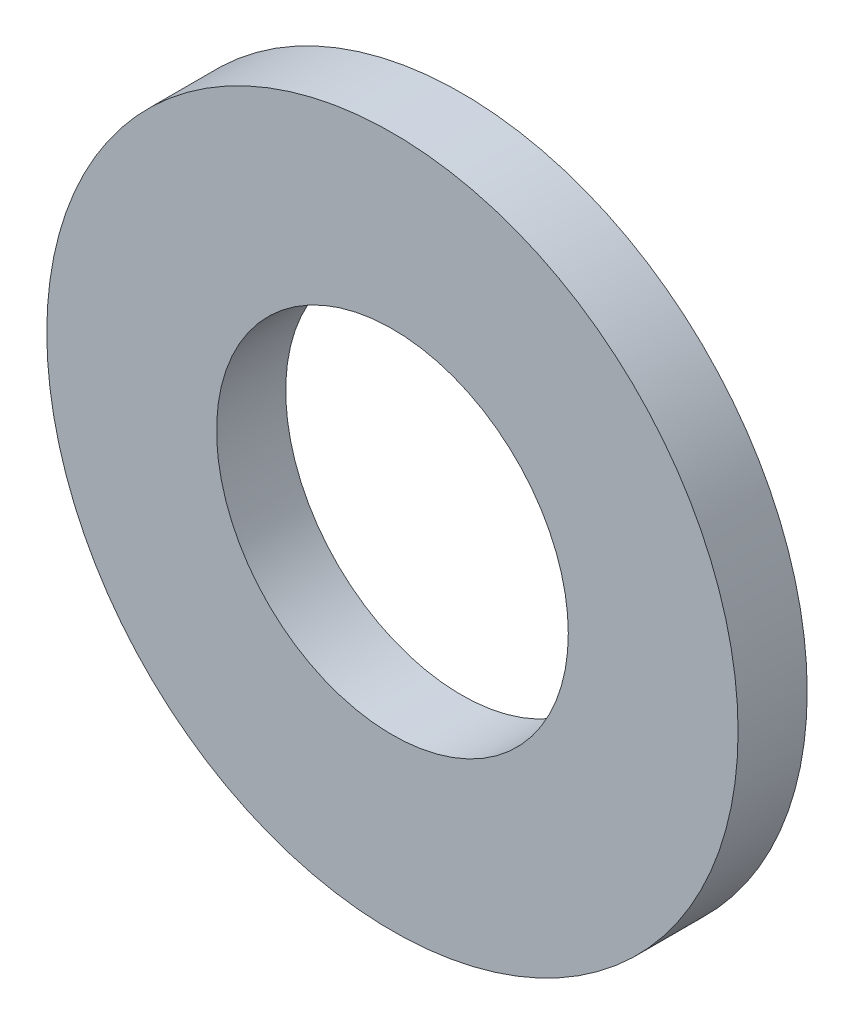
ISO-10303-21;
HEADER;
FILE_DESCRIPTION(('STEP AP214'),'2;1');
FILE_NAME('part.step','',(''),(''),'','','');
FILE_SCHEMA(('AUTOMOTIVE_DESIGN { 1 0 10303 214 1 1 1 1 }'));
ENDSEC;
DATA;
#1=APPLICATION_CONTEXT('core data for automotive mechanical design processes');
#2=APPLICATION_PROTOCOL_DEFINITION('international standard','automotive_design',2000,#1);
#3=PRODUCT_CONTEXT('',#1,'mechanical');
#4=PRODUCT('Part','Part','',(#3));
#5=PRODUCT_RELATED_PRODUCT_CATEGORY('part','',(#4));
#6=PRODUCT_DEFINITION_FORMATION('','',#4);
#7=PRODUCT_DEFINITION_CONTEXT('part definition',#1,'design');
#8=PRODUCT_DEFINITION('design','',#6,#7);
#9=PRODUCT_DEFINITION_SHAPE('','',#8);
#10=(LENGTH_UNIT() NAMED_UNIT(*) SI_UNIT(.MILLI.,.METRE.));
#11=(NAMED_UNIT(*) PLANE_ANGLE_UNIT() SI_UNIT($,.RADIAN.));
#12=(NAMED_UNIT(*) SI_UNIT($,.STERADIAN.) SOLID_ANGLE_UNIT());
#13=UNCERTAINTY_MEASURE_WITH_UNIT(LENGTH_MEASURE(1.E-05),#10,'distance_accuracy_value','');
#14=(GEOMETRIC_REPRESENTATION_CONTEXT(3) GLOBAL_UNCERTAINTY_ASSIGNED_CONTEXT((#13)) GLOBAL_UNIT_ASSIGNED_CONTEXT((#10,
#11,#12)) REPRESENTATION_CONTEXT('',''));
#15=CARTESIAN_POINT('',(0.,0.,0.));
#16=DIRECTION('',(0.,0.,1.));
#17=DIRECTION('',(1.,0.,0.));
#18=AXIS2_PLACEMENT_3D('',#15,#16,#17);
#19=CARTESIAN_POINT('',(0.,0.,1.5875));
#20=DIRECTION('',(0.,0.,1.));
#21=DIRECTION('',(1.,0.,0.));
#22=AXIS2_PLACEMENT_3D('',#19,#20,#21);
#23=PLANE('',#22);
#24=CARTESIAN_POINT('',(0.,0.,1.5875));
#25=DIRECTION('',(0.,0.,1.));
#26=DIRECTION('',(1.,0.,0.));
#27=AXIS2_PLACEMENT_3D('',#24,#25,#26);
#28=CIRCLE('',#27,7.9375);
#29=CARTESIAN_POINT('',(7.9375,0.,1.5875));
#30=VERTEX_POINT('',#29);
#31=EDGE_CURVE('E10',#30,#30,#28,.T.);
#32=ORIENTED_EDGE('',*,*,#31,.T.);
#33=EDGE_LOOP('',(#32));
#34=FACE_BOUND('',#33,.T.);
#35=CARTESIAN_POINT('',(0.,0.,1.5875));
#36=DIRECTION('',(0.,0.,1.));
#37=DIRECTION('',(1.,0.,0.));
#38=AXIS2_PLACEMENT_3D('',#35,#36,#37);
#39=CIRCLE('',#38,4.0386);
#40=CARTESIAN_POINT('',(4.0386,0.,1.5875));
#41=VERTEX_POINT('',#40);
#42=EDGE_CURVE('E42',#41,#41,#39,.T.);
#43=ORIENTED_EDGE('',*,*,#42,.F.);
#44=EDGE_LOOP('',(#43));
#45=FACE_BOUND('',#44,.T.);
#46=ADVANCED_FACE('F31',(#34,#45),#23,.T.);
#47=CARTESIAN_POINT('',(0.,0.,0.));
#48=DIRECTION('',(0.,0.,1.));
#49=DIRECTION('',(1.,0.,0.));
#50=AXIS2_PLACEMENT_3D('',#47,#48,#49);
#51=PLANE('',#50);
#52=CARTESIAN_POINT('',(0.,0.,0.));
#53=DIRECTION('',(0.,0.,1.));
#54=DIRECTION('',(1.,0.,0.));
#55=AXIS2_PLACEMENT_3D('',#52,#53,#54);
#56=CIRCLE('',#55,7.9375);
#57=CARTESIAN_POINT('',(7.9375,0.,0.));
#58=VERTEX_POINT('',#57);
#59=EDGE_CURVE('E35',#58,#58,#56,.T.);
#60=ORIENTED_EDGE('',*,*,#59,.F.);
#61=EDGE_LOOP('',(#60));
#62=FACE_BOUND('',#61,.T.);
#63=CARTESIAN_POINT('',(0.,0.,0.));
#64=DIRECTION('',(0.,0.,1.));
#65=DIRECTION('',(1.,0.,0.));
#66=AXIS2_PLACEMENT_3D('',#63,#64,#65);
#67=CIRCLE('',#66,4.0386);
#68=CARTESIAN_POINT('',(4.0386,0.,0.));
#69=VERTEX_POINT('',#68);
#70=EDGE_CURVE('E44',#69,#69,#67,.T.);
#71=ORIENTED_EDGE('',*,*,#70,.T.);
#72=EDGE_LOOP('',(#71));
#73=FACE_BOUND('',#72,.T.);
#74=ADVANCED_FACE('F54',(#62,#73),#51,.F.);
#75=CARTESIAN_POINT('',(0.,0.,1.5875));
#76=DIRECTION('',(0.,0.,-1.));
#77=DIRECTION('',(-1.,0.,0.));
#78=AXIS2_PLACEMENT_3D('',#75,#76,#77);
#79=CYLINDRICAL_SURFACE('',#78,7.9375);
#80=ORIENTED_EDGE('',*,*,#31,.F.);
#81=EDGE_LOOP('',(#80));
#82=FACE_BOUND('',#81,.T.);
#83=ORIENTED_EDGE('',*,*,#59,.T.);
#84=EDGE_LOOP('',(#83));
#85=FACE_BOUND('',#84,.T.);
#86=ADVANCED_FACE('F33',(#82,#85),#79,.T.);
#87=CARTESIAN_POINT('',(0.,0.,1.5875));
#88=DIRECTION('',(0.,0.,-1.));
#89=DIRECTION('',(-1.,0.,0.));
#90=AXIS2_PLACEMENT_3D('',#87,#88,#89);
#91=CYLINDRICAL_SURFACE('',#90,4.0386);
#92=ORIENTED_EDGE('',*,*,#42,.T.);
#93=EDGE_LOOP('',(#92));
#94=FACE_BOUND('',#93,.T.);
#95=ORIENTED_EDGE('',*,*,#70,.F.);
#96=EDGE_LOOP('',(#95));
#97=FACE_BOUND('',#96,.T.);
#98=ADVANCED_FACE('F50',(#94,#97),#91,.F.);
#99=CLOSED_SHELL('',(#46,#74,#86,#98));
#100=MANIFOLD_SOLID_BREP('B2',#99);
#101=ADVANCED_BREP_SHAPE_REPRESENTATION('',(#18,#100),#14);
#102=SHAPE_DEFINITION_REPRESENTATION(#9,#101);
ENDSEC;
END-ISO-10303-21;
